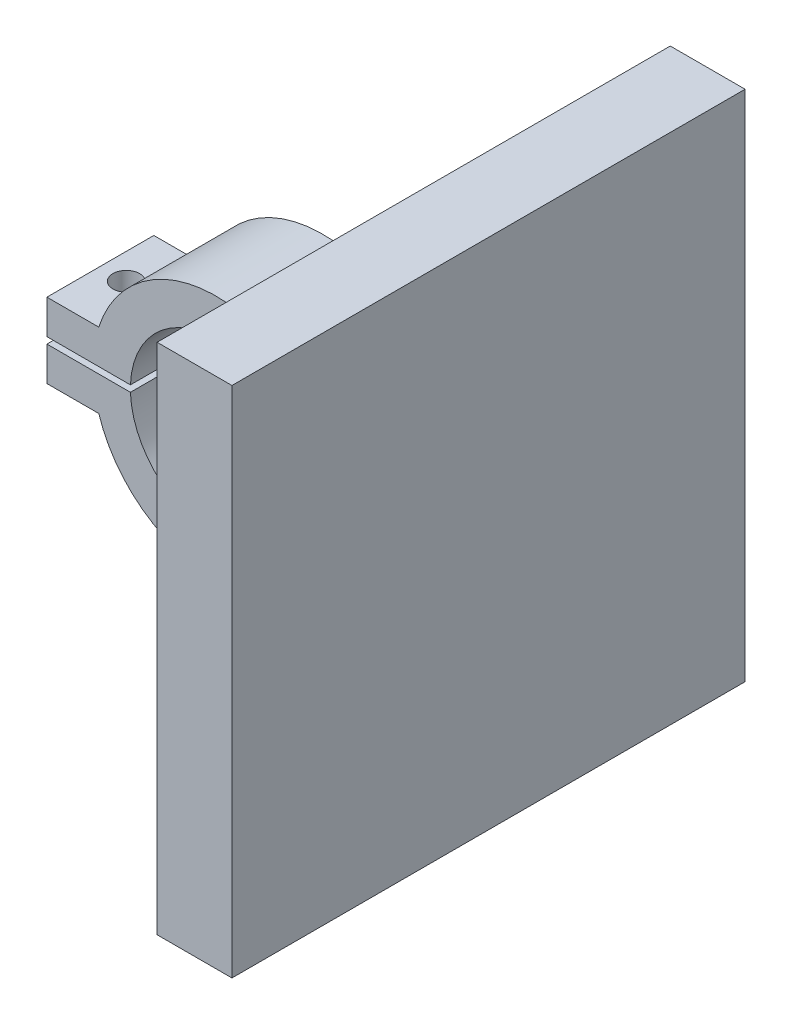
ISO-10303-21;
HEADER;
FILE_DESCRIPTION(('STEP AP214'),'2;1');
FILE_NAME('part.step','',(''),(''),'','','');
FILE_SCHEMA(('AUTOMOTIVE_DESIGN { 1 0 10303 214 1 1 1 1 }'));
ENDSEC;
DATA;
#1=APPLICATION_CONTEXT('core data for automotive mechanical design processes');
#2=APPLICATION_PROTOCOL_DEFINITION('international standard','automotive_design',2000,#1);
#3=PRODUCT_CONTEXT('',#1,'mechanical');
#4=PRODUCT('Part','Part','',(#3));
#5=PRODUCT_RELATED_PRODUCT_CATEGORY('part','',(#4));
#6=PRODUCT_DEFINITION_FORMATION('','',#4);
#7=PRODUCT_DEFINITION_CONTEXT('part definition',#1,'design');
#8=PRODUCT_DEFINITION('design','',#6,#7);
#9=PRODUCT_DEFINITION_SHAPE('','',#8);
#10=(LENGTH_UNIT() NAMED_UNIT(*) SI_UNIT(.MILLI.,.METRE.));
#11=(NAMED_UNIT(*) PLANE_ANGLE_UNIT() SI_UNIT($,.RADIAN.));
#12=(NAMED_UNIT(*) SI_UNIT($,.STERADIAN.) SOLID_ANGLE_UNIT());
#13=UNCERTAINTY_MEASURE_WITH_UNIT(LENGTH_MEASURE(1.E-05),#10,'distance_accuracy_value','');
#14=(GEOMETRIC_REPRESENTATION_CONTEXT(3) GLOBAL_UNCERTAINTY_ASSIGNED_CONTEXT((#13)) GLOBAL_UNIT_ASSIGNED_CONTEXT((#10,
#11,#12)) REPRESENTATION_CONTEXT('',''));
#15=CARTESIAN_POINT('',(0.,0.,0.));
#16=DIRECTION('',(0.,0.,1.));
#17=DIRECTION('',(1.,0.,0.));
#18=AXIS2_PLACEMENT_3D('',#15,#16,#17);
#19=CARTESIAN_POINT('',(0.,0.,5.));
#20=DIRECTION('',(0.,0.,-1.));
#21=DIRECTION('',(-1.,0.,0.));
#22=AXIS2_PLACEMENT_3D('',#19,#20,#21);
#23=CYLINDRICAL_SURFACE('',#22,5.75);
#24=CARTESIAN_POINT('',(0.,0.,0.));
#25=DIRECTION('',(0.,0.,1.));
#26=DIRECTION('',(1.,0.,0.));
#27=AXIS2_PLACEMENT_3D('',#24,#25,#26);
#28=CIRCLE('',#27,5.75);
#29=CARTESIAN_POINT('',(-5.47722557505166,-1.75,0.));
#30=VERTEX_POINT('',#29);
#31=CARTESIAN_POINT('',(5.39096466321196,-2.,0.));
#32=VERTEX_POINT('',#31);
#33=EDGE_CURVE('E164',#30,#32,#28,.T.);
#34=ORIENTED_EDGE('',*,*,#33,.T.);
#35=DIRECTION('',(0.,0.,-1.));
#36=VECTOR('',#35,1.);
#37=CARTESIAN_POINT('',(5.39096466321196,-2.,5.));
#38=LINE('',#37,#36);
#39=CARTESIAN_POINT('',(5.39096466321196,-2.,5.));
#40=VERTEX_POINT('',#39);
#41=EDGE_CURVE('E11',#40,#32,#38,.T.);
#42=ORIENTED_EDGE('',*,*,#41,.F.);
#43=CARTESIAN_POINT('',(0.,0.,5.));
#44=DIRECTION('',(0.,0.,1.));
#45=DIRECTION('',(1.,0.,0.));
#46=AXIS2_PLACEMENT_3D('',#43,#44,#45);
#47=CIRCLE('',#46,5.75);
#48=CARTESIAN_POINT('',(-5.47722557505166,-1.75,5.));
#49=VERTEX_POINT('',#48);
#50=EDGE_CURVE('E192',#49,#40,#47,.T.);
#51=ORIENTED_EDGE('',*,*,#50,.F.);
#52=DIRECTION('',(0.,0.,-1.));
#53=VECTOR('',#52,1.);
#54=CARTESIAN_POINT('',(-5.47722557505166,-1.75,5.));
#55=LINE('',#54,#53);
#56=EDGE_CURVE('E163',#49,#30,#55,.T.);
#57=ORIENTED_EDGE('',*,*,#56,.T.);
#58=EDGE_LOOP('',(#34,#42,#51,#57));
#59=FACE_BOUND('',#58,.T.);
#60=ADVANCED_FACE('F41',(#59),#23,.T.);
#61=CARTESIAN_POINT('',(0.,-2.,5.));
#62=DIRECTION('',(0.,1.,0.));
#63=DIRECTION('',(0.,0.,1.));
#64=AXIS2_PLACEMENT_3D('',#61,#62,#63);
#65=PLANE('',#64);
#66=DIRECTION('',(1.,0.,0.));
#67=VECTOR('',#66,1.);
#68=CARTESIAN_POINT('',(0.,-2.,0.));
#69=LINE('',#68,#67);
#70=CARTESIAN_POINT('',(6.7507426012175,-2.,0.));
#71=VERTEX_POINT('',#70);
#72=EDGE_CURVE('E167',#32,#71,#69,.T.);
#73=ORIENTED_EDGE('',*,*,#72,.T.);
#74=DIRECTION('',(0.,0.,-1.));
#75=VECTOR('',#74,1.);
#76=CARTESIAN_POINT('',(6.7507426012175,-2.,5.));
#77=LINE('',#76,#75);
#78=CARTESIAN_POINT('',(6.7507426012175,-2.,5.));
#79=VERTEX_POINT('',#78);
#80=EDGE_CURVE('E51',#79,#71,#77,.T.);
#81=ORIENTED_EDGE('',*,*,#80,.F.);
#82=DIRECTION('',(1.,0.,0.));
#83=VECTOR('',#82,1.);
#84=CARTESIAN_POINT('',(0.,-2.,5.));
#85=LINE('',#84,#83);
#86=EDGE_CURVE('E111',#40,#79,#85,.T.);
#87=ORIENTED_EDGE('',*,*,#86,.F.);
#88=ORIENTED_EDGE('',*,*,#41,.T.);
#89=EDGE_LOOP('',(#73,#81,#87,#88));
#90=FACE_BOUND('',#89,.T.);
#91=ADVANCED_FACE('F43',(#90),#65,.F.);
#92=CARTESIAN_POINT('',(0.,2.,5.));
#93=DIRECTION('',(0.,1.,0.));
#94=DIRECTION('',(0.,0.,1.));
#95=AXIS2_PLACEMENT_3D('',#92,#93,#94);
#96=PLANE('',#95);
#97=DIRECTION('',(1.,0.,0.));
#98=VECTOR('',#97,1.);
#99=CARTESIAN_POINT('',(0.,2.,0.));
#100=LINE('',#99,#98);
#101=CARTESIAN_POINT('',(5.39096466321196,2.,0.));
#102=VERTEX_POINT('',#101);
#103=CARTESIAN_POINT('',(6.7507426012175,2.,0.));
#104=VERTEX_POINT('',#103);
#105=EDGE_CURVE('E175',#102,#104,#100,.T.);
#106=ORIENTED_EDGE('',*,*,#105,.F.);
#107=DIRECTION('',(0.,0.,-1.));
#108=VECTOR('',#107,1.);
#109=CARTESIAN_POINT('',(5.39096466321196,2.,5.));
#110=LINE('',#109,#108);
#111=CARTESIAN_POINT('',(5.39096466321196,2.,5.));
#112=VERTEX_POINT('',#111);
#113=EDGE_CURVE('E205',#112,#102,#110,.T.);
#114=ORIENTED_EDGE('',*,*,#113,.F.);
#115=DIRECTION('',(1.,0.,0.));
#116=VECTOR('',#115,1.);
#117=CARTESIAN_POINT('',(0.,2.,5.));
#118=LINE('',#117,#116);
#119=CARTESIAN_POINT('',(6.7507426012175,2.,5.));
#120=VERTEX_POINT('',#119);
#121=EDGE_CURVE('E230',#112,#120,#118,.T.);
#122=ORIENTED_EDGE('',*,*,#121,.T.);
#123=DIRECTION('',(0.,0.,-1.));
#124=VECTOR('',#123,1.);
#125=CARTESIAN_POINT('',(6.7507426012175,2.,5.));
#126=LINE('',#125,#124);
#127=EDGE_CURVE('E207',#120,#104,#126,.T.);
#128=ORIENTED_EDGE('',*,*,#127,.T.);
#129=EDGE_LOOP('',(#106,#114,#122,#128));
#130=FACE_BOUND('',#129,.T.);
#131=ADVANCED_FACE('F226',(#130),#96,.T.);
#132=CARTESIAN_POINT('',(-5.47722557505166,1.75,0.));
#133=VERTEX_POINT('',#132);
#134=EDGE_CURVE('E169',#102,#133,#28,.T.);
#135=ORIENTED_EDGE('',*,*,#134,.T.);
#136=DIRECTION('',(0.,0.,-1.));
#137=VECTOR('',#136,1.);
#138=CARTESIAN_POINT('',(-5.47722557505166,1.75,5.));
#139=LINE('',#138,#137);
#140=CARTESIAN_POINT('',(-5.47722557505166,1.75,5.));
#141=VERTEX_POINT('',#140);
#142=EDGE_CURVE('E203',#141,#133,#139,.T.);
#143=ORIENTED_EDGE('',*,*,#142,.F.);
#144=EDGE_CURVE('E231',#112,#141,#47,.T.);
#145=ORIENTED_EDGE('',*,*,#144,.F.);
#146=ORIENTED_EDGE('',*,*,#113,.T.);
#147=EDGE_LOOP('',(#135,#143,#145,#146));
#148=FACE_BOUND('',#147,.T.);
#149=ADVANCED_FACE('F259',(#148),#23,.T.);
#150=CARTESIAN_POINT('',(0.,1.75,5.));
#151=DIRECTION('',(0.,1.,0.));
#152=DIRECTION('',(0.,0.,1.));
#153=AXIS2_PLACEMENT_3D('',#150,#151,#152);
#154=PLANE('',#153);
#155=CARTESIAN_POINT('',(-6.69017596628356,1.75,2.5));
#156=DIRECTION('',(0.,1.,0.));
#157=DIRECTION('',(0.,0.,1.));
#158=AXIS2_PLACEMENT_3D('',#155,#156,#157);
#159=CIRCLE('',#158,0.625);
#160=CARTESIAN_POINT('',(-6.69017596628356,1.75,3.125));
#161=VERTEX_POINT('',#160);
#162=EDGE_CURVE('E168',#161,#161,#159,.T.);
#163=ORIENTED_EDGE('',*,*,#162,.F.);
#164=EDGE_LOOP('',(#163));
#165=FACE_BOUND('',#164,.T.);
#166=DIRECTION('',(1.,0.,0.));
#167=VECTOR('',#166,1.);
#168=CARTESIAN_POINT('',(0.,1.75,0.));
#169=LINE('',#168,#167);
#170=CARTESIAN_POINT('',(-7.90312635751546,1.75,0.));
#171=VERTEX_POINT('',#170);
#172=EDGE_CURVE('E178',#171,#133,#169,.T.);
#173=ORIENTED_EDGE('',*,*,#172,.F.);
#174=DIRECTION('',(0.,0.,-1.));
#175=VECTOR('',#174,1.);
#176=CARTESIAN_POINT('',(-7.90312635751546,1.75,5.));
#177=LINE('',#176,#175);
#178=CARTESIAN_POINT('',(-7.90312635751546,1.75,5.));
#179=VERTEX_POINT('',#178);
#180=EDGE_CURVE('E201',#179,#171,#177,.T.);
#181=ORIENTED_EDGE('',*,*,#180,.F.);
#182=DIRECTION('',(1.,0.,0.));
#183=VECTOR('',#182,1.);
#184=CARTESIAN_POINT('',(0.,1.75,5.));
#185=LINE('',#184,#183);
#186=EDGE_CURVE('E233',#179,#141,#185,.T.);
#187=ORIENTED_EDGE('',*,*,#186,.T.);
#188=ORIENTED_EDGE('',*,*,#142,.T.);
#189=EDGE_LOOP('',(#173,#181,#187,#188));
#190=FACE_BOUND('',#189,.T.);
#191=ADVANCED_FACE('F256',(#165,#190),#154,.T.);
#192=CARTESIAN_POINT('',(-7.90312635751546,0.,5.));
#193=DIRECTION('',(1.,0.,0.));
#194=DIRECTION('',(0.,0.,-1.));
#195=AXIS2_PLACEMENT_3D('',#192,#193,#194);
#196=PLANE('',#195);
#197=DIRECTION('',(0.,-1.,0.));
#198=VECTOR('',#197,1.);
#199=CARTESIAN_POINT('',(-7.90312635751546,0.,0.));
#200=LINE('',#199,#198);
#201=CARTESIAN_POINT('',(-7.90312635751546,0.149999999999998,0.));
#202=VERTEX_POINT('',#201);
#203=EDGE_CURVE('E181',#171,#202,#200,.T.);
#204=ORIENTED_EDGE('',*,*,#203,.T.);
#205=DIRECTION('',(0.,0.,-1.));
#206=VECTOR('',#205,1.);
#207=CARTESIAN_POINT('',(-7.90312635751546,0.149999999999998,5.));
#208=LINE('',#207,#206);
#209=CARTESIAN_POINT('',(-7.90312635751546,0.149999999999998,5.));
#210=VERTEX_POINT('',#209);
#211=EDGE_CURVE('E198',#210,#202,#208,.T.);
#212=ORIENTED_EDGE('',*,*,#211,.F.);
#213=DIRECTION('',(0.,-1.,0.));
#214=VECTOR('',#213,1.);
#215=CARTESIAN_POINT('',(-7.90312635751546,0.,5.));
#216=LINE('',#215,#214);
#217=EDGE_CURVE('E240',#179,#210,#216,.T.);
#218=ORIENTED_EDGE('',*,*,#217,.F.);
#219=ORIENTED_EDGE('',*,*,#180,.T.);
#220=EDGE_LOOP('',(#204,#212,#218,#219));
#221=FACE_BOUND('',#220,.T.);
#222=ADVANCED_FACE('F266',(#221),#196,.F.);
#223=CARTESIAN_POINT('',(0.,0.149999999999999,5.));
#224=DIRECTION('',(0.,1.,0.));
#225=DIRECTION('',(-1.,0.,0.));
#226=AXIS2_PLACEMENT_3D('',#223,#224,#225);
#227=PLANE('',#226);
#228=CARTESIAN_POINT('',(-6.69017596628356,0.149999999999998,2.5));
#229=DIRECTION('',(0.,1.,0.));
#230=DIRECTION('',(-1.,0.,0.));
#231=AXIS2_PLACEMENT_3D('',#228,#229,#230);
#232=CIRCLE('',#231,0.625);
#233=CARTESIAN_POINT('',(-7.31517596628356,0.149999999999998,2.5));
#234=VERTEX_POINT('',#233);
#235=EDGE_CURVE('E556',#234,#234,#232,.T.);
#236=ORIENTED_EDGE('',*,*,#235,.T.);
#237=EDGE_LOOP('',(#236));
#238=FACE_BOUND('',#237,.T.);
#239=DIRECTION('',(1.,0.,0.));
#240=VECTOR('',#239,1.);
#241=CARTESIAN_POINT('',(0.,0.149999999999999,0.));
#242=LINE('',#241,#240);
#243=CARTESIAN_POINT('',(-3.99718651053463,0.149999999999999,0.));
#244=VERTEX_POINT('',#243);
#245=EDGE_CURVE('E183',#202,#244,#242,.T.);
#246=ORIENTED_EDGE('',*,*,#245,.T.);
#247=DIRECTION('',(0.,0.,-1.));
#248=VECTOR('',#247,1.);
#249=CARTESIAN_POINT('',(-3.99718651053463,0.149999999999999,5.));
#250=LINE('',#249,#248);
#251=CARTESIAN_POINT('',(-3.99718651053463,0.149999999999999,5.));
#252=VERTEX_POINT('',#251);
#253=EDGE_CURVE('E196',#252,#244,#250,.T.);
#254=ORIENTED_EDGE('',*,*,#253,.F.);
#255=DIRECTION('',(1.,0.,0.));
#256=VECTOR('',#255,1.);
#257=CARTESIAN_POINT('',(0.,0.149999999999999,5.));
#258=LINE('',#257,#256);
#259=EDGE_CURVE('E158',#210,#252,#258,.T.);
#260=ORIENTED_EDGE('',*,*,#259,.F.);
#261=ORIENTED_EDGE('',*,*,#211,.T.);
#262=EDGE_LOOP('',(#246,#254,#260,#261));
#263=FACE_BOUND('',#262,.T.);
#264=ADVANCED_FACE('F247',(#238,#263),#227,.F.);
#265=CARTESIAN_POINT('',(0.,0.,5.));
#266=DIRECTION('',(0.,0.,-1.));
#267=DIRECTION('',(-1.,0.,0.));
#268=AXIS2_PLACEMENT_3D('',#265,#266,#267);
#269=CYLINDRICAL_SURFACE('',#268,4.);
#270=CARTESIAN_POINT('',(0.,0.,0.));
#271=DIRECTION('',(0.,0.,1.));
#272=DIRECTION('',(1.,0.,0.));
#273=AXIS2_PLACEMENT_3D('',#270,#271,#272);
#274=CIRCLE('',#273,4.);
#275=CARTESIAN_POINT('',(-3.99718651053463,-0.150000000000001,0.));
#276=VERTEX_POINT('',#275);
#277=EDGE_CURVE('E186',#276,#244,#274,.T.);
#278=ORIENTED_EDGE('',*,*,#277,.F.);
#279=DIRECTION('',(0.,0.,-1.));
#280=VECTOR('',#279,1.);
#281=CARTESIAN_POINT('',(-3.99718651053463,-0.150000000000001,5.));
#282=LINE('',#281,#280);
#283=CARTESIAN_POINT('',(-3.99718651053463,-0.150000000000001,5.));
#284=VERTEX_POINT('',#283);
#285=EDGE_CURVE('E147',#284,#276,#282,.T.);
#286=ORIENTED_EDGE('',*,*,#285,.F.);
#287=CARTESIAN_POINT('',(0.,0.,5.));
#288=DIRECTION('',(0.,0.,1.));
#289=DIRECTION('',(1.,0.,0.));
#290=AXIS2_PLACEMENT_3D('',#287,#288,#289);
#291=CIRCLE('',#290,4.);
#292=EDGE_CURVE('E156',#284,#252,#291,.T.);
#293=ORIENTED_EDGE('',*,*,#292,.T.);
#294=ORIENTED_EDGE('',*,*,#253,.T.);
#295=EDGE_LOOP('',(#278,#286,#293,#294));
#296=FACE_BOUND('',#295,.T.);
#297=ADVANCED_FACE('F251',(#296),#269,.F.);
#298=CARTESIAN_POINT('',(0.,-0.150000000000001,5.));
#299=DIRECTION('',(0.,1.,0.));
#300=DIRECTION('',(-1.,0.,0.));
#301=AXIS2_PLACEMENT_3D('',#298,#299,#300);
#302=PLANE('',#301);
#303=CARTESIAN_POINT('',(-6.69017596628356,-0.150000000000002,2.5));
#304=DIRECTION('',(0.,1.,0.));
#305=DIRECTION('',(-1.,0.,0.));
#306=AXIS2_PLACEMENT_3D('',#303,#304,#305);
#307=CIRCLE('',#306,0.625);
#308=CARTESIAN_POINT('',(-7.31517596628356,-0.150000000000002,2.5));
#309=VERTEX_POINT('',#308);
#310=EDGE_CURVE('E548',#309,#309,#307,.T.);
#311=ORIENTED_EDGE('',*,*,#310,.F.);
#312=EDGE_LOOP('',(#311));
#313=FACE_BOUND('',#312,.T.);
#314=DIRECTION('',(1.,0.,0.));
#315=VECTOR('',#314,1.);
#316=CARTESIAN_POINT('',(0.,-0.150000000000001,0.));
#317=LINE('',#316,#315);
#318=CARTESIAN_POINT('',(-7.90312635751546,-0.150000000000002,0.));
#319=VERTEX_POINT('',#318);
#320=EDGE_CURVE('E146',#319,#276,#317,.T.);
#321=ORIENTED_EDGE('',*,*,#320,.F.);
#322=DIRECTION('',(0.,0.,-1.));
#323=VECTOR('',#322,1.);
#324=CARTESIAN_POINT('',(-7.90312635751546,-0.150000000000002,5.));
#325=LINE('',#324,#323);
#326=CARTESIAN_POINT('',(-7.90312635751546,-0.150000000000002,5.));
#327=VERTEX_POINT('',#326);
#328=EDGE_CURVE('E140',#327,#319,#325,.T.);
#329=ORIENTED_EDGE('',*,*,#328,.F.);
#330=DIRECTION('',(1.,0.,0.));
#331=VECTOR('',#330,1.);
#332=CARTESIAN_POINT('',(0.,-0.150000000000001,5.));
#333=LINE('',#332,#331);
#334=EDGE_CURVE('E144',#327,#284,#333,.T.);
#335=ORIENTED_EDGE('',*,*,#334,.T.);
#336=ORIENTED_EDGE('',*,*,#285,.T.);
#337=EDGE_LOOP('',(#321,#329,#335,#336));
#338=FACE_BOUND('',#337,.T.);
#339=ADVANCED_FACE('F142',(#313,#338),#302,.T.);
#340=CARTESIAN_POINT('',(-7.90312635751546,0.,5.));
#341=DIRECTION('',(1.,0.,0.));
#342=DIRECTION('',(0.,0.,-1.));
#343=AXIS2_PLACEMENT_3D('',#340,#341,#342);
#344=PLANE('',#343);
#345=DIRECTION('',(0.,-1.,0.));
#346=VECTOR('',#345,1.);
#347=CARTESIAN_POINT('',(-7.90312635751546,0.,0.));
#348=LINE('',#347,#346);
#349=CARTESIAN_POINT('',(-7.90312635751546,-1.75,0.));
#350=VERTEX_POINT('',#349);
#351=EDGE_CURVE('E97',#319,#350,#348,.T.);
#352=ORIENTED_EDGE('',*,*,#351,.T.);
#353=DIRECTION('',(0.,0.,-1.));
#354=VECTOR('',#353,1.);
#355=CARTESIAN_POINT('',(-7.90312635751546,-1.75,5.));
#356=LINE('',#355,#354);
#357=CARTESIAN_POINT('',(-7.90312635751546,-1.75,5.));
#358=VERTEX_POINT('',#357);
#359=EDGE_CURVE('E148',#358,#350,#356,.T.);
#360=ORIENTED_EDGE('',*,*,#359,.F.);
#361=DIRECTION('',(0.,-1.,0.));
#362=VECTOR('',#361,1.);
#363=CARTESIAN_POINT('',(-7.90312635751546,0.,5.));
#364=LINE('',#363,#362);
#365=EDGE_CURVE('E150',#327,#358,#364,.T.);
#366=ORIENTED_EDGE('',*,*,#365,.F.);
#367=ORIENTED_EDGE('',*,*,#328,.T.);
#368=EDGE_LOOP('',(#352,#360,#366,#367));
#369=FACE_BOUND('',#368,.T.);
#370=ADVANCED_FACE('F151',(#369),#344,.F.);
#371=CARTESIAN_POINT('',(0.,-1.75,5.));
#372=DIRECTION('',(0.,1.,0.));
#373=DIRECTION('',(0.,0.,1.));
#374=AXIS2_PLACEMENT_3D('',#371,#372,#373);
#375=PLANE('',#374);
#376=CARTESIAN_POINT('',(-6.69017596628356,-1.75,2.5));
#377=DIRECTION('',(0.,1.,0.));
#378=DIRECTION('',(0.,0.,1.));
#379=AXIS2_PLACEMENT_3D('',#376,#377,#378);
#380=CIRCLE('',#379,0.625);
#381=CARTESIAN_POINT('',(-6.69017596628356,-1.75,3.125));
#382=VERTEX_POINT('',#381);
#383=EDGE_CURVE('E45',#382,#382,#380,.T.);
#384=ORIENTED_EDGE('',*,*,#383,.T.);
#385=EDGE_LOOP('',(#384));
#386=FACE_BOUND('',#385,.T.);
#387=DIRECTION('',(1.,0.,0.));
#388=VECTOR('',#387,1.);
#389=CARTESIAN_POINT('',(0.,-1.75,0.));
#390=LINE('',#389,#388);
#391=EDGE_CURVE('E103',#350,#30,#390,.T.);
#392=ORIENTED_EDGE('',*,*,#391,.T.);
#393=ORIENTED_EDGE('',*,*,#56,.F.);
#394=DIRECTION('',(1.,0.,0.));
#395=VECTOR('',#394,1.);
#396=CARTESIAN_POINT('',(0.,-1.75,5.));
#397=LINE('',#396,#395);
#398=EDGE_CURVE('E59',#358,#49,#397,.T.);
#399=ORIENTED_EDGE('',*,*,#398,.F.);
#400=ORIENTED_EDGE('',*,*,#359,.T.);
#401=EDGE_LOOP('',(#392,#393,#399,#400));
#402=FACE_BOUND('',#401,.T.);
#403=ADVANCED_FACE('F275',(#386,#402),#375,.F.);
#404=CARTESIAN_POINT('',(0.,0.,5.));
#405=DIRECTION('',(0.,0.,1.));
#406=DIRECTION('',(1.,0.,0.));
#407=AXIS2_PLACEMENT_3D('',#404,#405,#406);
#408=PLANE('',#407);
#409=ORIENTED_EDGE('',*,*,#50,.T.);
#410=ORIENTED_EDGE('',*,*,#86,.T.);
#411=DIRECTION('',(0.,-1.,0.));
#412=VECTOR('',#411,1.);
#413=CARTESIAN_POINT('',(6.7507426012175,0.,5.));
#414=LINE('',#413,#412);
#415=EDGE_CURVE('E216',#120,#79,#414,.T.);
#416=ORIENTED_EDGE('',*,*,#415,.F.);
#417=ORIENTED_EDGE('',*,*,#121,.F.);
#418=ORIENTED_EDGE('',*,*,#144,.T.);
#419=ORIENTED_EDGE('',*,*,#186,.F.);
#420=ORIENTED_EDGE('',*,*,#217,.T.);
#421=ORIENTED_EDGE('',*,*,#259,.T.);
#422=ORIENTED_EDGE('',*,*,#292,.F.);
#423=ORIENTED_EDGE('',*,*,#334,.F.);
#424=ORIENTED_EDGE('',*,*,#365,.T.);
#425=ORIENTED_EDGE('',*,*,#398,.T.);
#426=EDGE_LOOP('',(#409,#410,#416,#417,#418,#419,#420,#421,#422,#423,#424,#425));
#427=FACE_BOUND('',#426,.T.);
#428=ADVANCED_FACE('F154',(#427),#408,.T.);
#429=CARTESIAN_POINT('',(0.,0.,0.));
#430=DIRECTION('',(0.,0.,1.));
#431=DIRECTION('',(1.,0.,0.));
#432=AXIS2_PLACEMENT_3D('',#429,#430,#431);
#433=PLANE('',#432);
#434=ORIENTED_EDGE('',*,*,#33,.F.);
#435=ORIENTED_EDGE('',*,*,#391,.F.);
#436=ORIENTED_EDGE('',*,*,#351,.F.);
#437=ORIENTED_EDGE('',*,*,#320,.T.);
#438=ORIENTED_EDGE('',*,*,#277,.T.);
#439=ORIENTED_EDGE('',*,*,#245,.F.);
#440=ORIENTED_EDGE('',*,*,#203,.F.);
#441=ORIENTED_EDGE('',*,*,#172,.T.);
#442=ORIENTED_EDGE('',*,*,#134,.F.);
#443=ORIENTED_EDGE('',*,*,#105,.T.);
#444=DIRECTION('',(0.,-1.,0.));
#445=VECTOR('',#444,1.);
#446=CARTESIAN_POINT('',(6.7507426012175,0.,0.));
#447=LINE('',#446,#445);
#448=EDGE_CURVE('E172',#104,#71,#447,.T.);
#449=ORIENTED_EDGE('',*,*,#448,.T.);
#450=ORIENTED_EDGE('',*,*,#72,.F.);
#451=EDGE_LOOP('',(#434,#435,#436,#437,#438,#439,#440,#441,#442,#443,#449,#450));
#452=FACE_BOUND('',#451,.T.);
#453=ADVANCED_FACE('F221',(#452),#433,.F.);
#454=CARTESIAN_POINT('',(-6.69017596628356,-5.75,2.5));
#455=DIRECTION('',(0.,1.,0.));
#456=DIRECTION('',(0.,0.,1.));
#457=AXIS2_PLACEMENT_3D('',#454,#455,#456);
#458=CYLINDRICAL_SURFACE('',#457,0.625);
#459=ORIENTED_EDGE('',*,*,#310,.T.);
#460=EDGE_LOOP('',(#459));
#461=FACE_BOUND('',#460,.T.);
#462=ORIENTED_EDGE('',*,*,#383,.F.);
#463=EDGE_LOOP('',(#462));
#464=FACE_BOUND('',#463,.T.);
#465=ADVANCED_FACE('F366',(#461,#464),#458,.F.);
#466=ORIENTED_EDGE('',*,*,#162,.T.);
#467=EDGE_LOOP('',(#466));
#468=FACE_BOUND('',#467,.T.);
#469=ORIENTED_EDGE('',*,*,#235,.F.);
#470=EDGE_LOOP('',(#469));
#471=FACE_BOUND('',#470,.T.);
#472=ADVANCED_FACE('F375',(#468,#471),#458,.F.);
#473=CARTESIAN_POINT('',(10.2507426012175,12.,-9.49999999999999));
#474=DIRECTION('',(0.,0.,1.));
#475=DIRECTION('',(0.,-1.,0.));
#476=AXIS2_PLACEMENT_3D('',#473,#474,#475);
#477=PLANE('',#476);
#478=DIRECTION('',(0.,1.,0.));
#479=VECTOR('',#478,1.);
#480=CARTESIAN_POINT('',(6.7507426012175,12.,-9.49999999999999));
#481=LINE('',#480,#479);
#482=CARTESIAN_POINT('',(6.7507426012175,-12.,-9.5));
#483=VERTEX_POINT('',#482);
#484=CARTESIAN_POINT('',(6.7507426012175,12.,-9.49999999999999));
#485=VERTEX_POINT('',#484);
#486=EDGE_CURVE('E544',#483,#485,#481,.T.);
#487=ORIENTED_EDGE('',*,*,#486,.T.);
#488=DIRECTION('',(-1.,0.,0.));
#489=VECTOR('',#488,1.);
#490=CARTESIAN_POINT('',(10.2507426012175,12.,-9.49999999999999));
#491=LINE('',#490,#489);
#492=CARTESIAN_POINT('',(10.2507426012175,12.,-9.49999999999999));
#493=VERTEX_POINT('',#492);
#494=EDGE_CURVE('E541',#493,#485,#491,.T.);
#495=ORIENTED_EDGE('',*,*,#494,.F.);
#496=DIRECTION('',(0.,1.,0.));
#497=VECTOR('',#496,1.);
#498=CARTESIAN_POINT('',(10.2507426012175,12.,-9.49999999999999));
#499=LINE('',#498,#497);
#500=CARTESIAN_POINT('',(10.2507426012175,-12.,-9.5));
#501=VERTEX_POINT('',#500);
#502=EDGE_CURVE('E524',#501,#493,#499,.T.);
#503=ORIENTED_EDGE('',*,*,#502,.F.);
#504=DIRECTION('',(-1.,0.,0.));
#505=VECTOR('',#504,1.);
#506=CARTESIAN_POINT('',(10.2507426012175,-12.,-9.5));
#507=LINE('',#506,#505);
#508=EDGE_CURVE('E568',#501,#483,#507,.T.);
#509=ORIENTED_EDGE('',*,*,#508,.T.);
#510=EDGE_LOOP('',(#487,#495,#503,#509));
#511=FACE_BOUND('',#510,.T.);
#512=ADVANCED_FACE('F386',(#511),#477,.F.);
#513=CARTESIAN_POINT('',(10.2507426012175,12.,14.5));
#514=DIRECTION('',(0.,-1.,0.));
#515=DIRECTION('',(0.,0.,-1.));
#516=AXIS2_PLACEMENT_3D('',#513,#514,#515);
#517=PLANE('',#516);
#518=DIRECTION('',(0.,0.,1.));
#519=VECTOR('',#518,1.);
#520=CARTESIAN_POINT('',(6.7507426012175,12.,14.5));
#521=LINE('',#520,#519);
#522=CARTESIAN_POINT('',(6.7507426012175,12.,14.5));
#523=VERTEX_POINT('',#522);
#524=EDGE_CURVE('E575',#485,#523,#521,.T.);
#525=ORIENTED_EDGE('',*,*,#524,.T.);
#526=DIRECTION('',(-1.,0.,0.));
#527=VECTOR('',#526,1.);
#528=CARTESIAN_POINT('',(10.2507426012175,12.,14.5));
#529=LINE('',#528,#527);
#530=CARTESIAN_POINT('',(10.2507426012175,12.,14.5));
#531=VERTEX_POINT('',#530);
#532=EDGE_CURVE('E546',#531,#523,#529,.T.);
#533=ORIENTED_EDGE('',*,*,#532,.F.);
#534=DIRECTION('',(0.,0.,1.));
#535=VECTOR('',#534,1.);
#536=CARTESIAN_POINT('',(10.2507426012175,12.,14.5));
#537=LINE('',#536,#535);
#538=EDGE_CURVE('E529',#493,#531,#537,.T.);
#539=ORIENTED_EDGE('',*,*,#538,.F.);
#540=ORIENTED_EDGE('',*,*,#494,.T.);
#541=EDGE_LOOP('',(#525,#533,#539,#540));
#542=FACE_BOUND('',#541,.T.);
#543=ADVANCED_FACE('F395',(#542),#517,.F.);
#544=CARTESIAN_POINT('',(10.2507426012175,12.,14.5));
#545=DIRECTION('',(0.,0.,-1.));
#546=DIRECTION('',(0.,1.,0.));
#547=AXIS2_PLACEMENT_3D('',#544,#545,#546);
#548=PLANE('',#547);
#549=DIRECTION('',(0.,-1.,0.));
#550=VECTOR('',#549,1.);
#551=CARTESIAN_POINT('',(6.7507426012175,12.,14.5));
#552=LINE('',#551,#550);
#553=CARTESIAN_POINT('',(6.7507426012175,-12.,14.5));
#554=VERTEX_POINT('',#553);
#555=EDGE_CURVE('E572',#523,#554,#552,.T.);
#556=ORIENTED_EDGE('',*,*,#555,.T.);
#557=DIRECTION('',(-1.,0.,0.));
#558=VECTOR('',#557,1.);
#559=CARTESIAN_POINT('',(10.2507426012175,-12.,14.5));
#560=LINE('',#559,#558);
#561=CARTESIAN_POINT('',(10.2507426012175,-12.,14.5));
#562=VERTEX_POINT('',#561);
#563=EDGE_CURVE('E550',#562,#554,#560,.T.);
#564=ORIENTED_EDGE('',*,*,#563,.F.);
#565=DIRECTION('',(0.,-1.,0.));
#566=VECTOR('',#565,1.);
#567=CARTESIAN_POINT('',(10.2507426012175,12.,14.5));
#568=LINE('',#567,#566);
#569=EDGE_CURVE('E579',#531,#562,#568,.T.);
#570=ORIENTED_EDGE('',*,*,#569,.F.);
#571=ORIENTED_EDGE('',*,*,#532,.T.);
#572=EDGE_LOOP('',(#556,#564,#570,#571));
#573=FACE_BOUND('',#572,.T.);
#574=ADVANCED_FACE('F405',(#573),#548,.F.);
#575=CARTESIAN_POINT('',(10.2507426012175,-12.,14.5));
#576=DIRECTION('',(0.,1.,0.));
#577=DIRECTION('',(0.,0.,1.));
#578=AXIS2_PLACEMENT_3D('',#575,#576,#577);
#579=PLANE('',#578);
#580=DIRECTION('',(0.,0.,-1.));
#581=VECTOR('',#580,1.);
#582=CARTESIAN_POINT('',(6.7507426012175,-12.,14.5));
#583=LINE('',#582,#581);
#584=EDGE_CURVE('E537',#554,#483,#583,.T.);
#585=ORIENTED_EDGE('',*,*,#584,.T.);
#586=ORIENTED_EDGE('',*,*,#508,.F.);
#587=DIRECTION('',(0.,0.,-1.));
#588=VECTOR('',#587,1.);
#589=CARTESIAN_POINT('',(10.2507426012175,-12.,14.5));
#590=LINE('',#589,#588);
#591=EDGE_CURVE('E532',#562,#501,#590,.T.);
#592=ORIENTED_EDGE('',*,*,#591,.F.);
#593=ORIENTED_EDGE('',*,*,#563,.T.);
#594=EDGE_LOOP('',(#585,#586,#592,#593));
#595=FACE_BOUND('',#594,.T.);
#596=ADVANCED_FACE('F415',(#595),#579,.F.);
#597=CARTESIAN_POINT('',(10.2507426012175,0.,0.));
#598=DIRECTION('',(1.,0.,0.));
#599=DIRECTION('',(0.,0.,-1.));
#600=AXIS2_PLACEMENT_3D('',#597,#598,#599);
#601=PLANE('',#600);
#602=ORIENTED_EDGE('',*,*,#502,.T.);
#603=ORIENTED_EDGE('',*,*,#538,.T.);
#604=ORIENTED_EDGE('',*,*,#569,.T.);
#605=ORIENTED_EDGE('',*,*,#591,.T.);
#606=EDGE_LOOP('',(#602,#603,#604,#605));
#607=FACE_BOUND('',#606,.T.);
#608=ADVANCED_FACE('F425',(#607),#601,.T.);
#609=CARTESIAN_POINT('',(6.7507426012175,0.,0.));
#610=DIRECTION('',(1.,0.,0.));
#611=DIRECTION('',(0.,0.,-1.));
#612=AXIS2_PLACEMENT_3D('',#609,#610,#611);
#613=PLANE('',#612);
#614=ORIENTED_EDGE('',*,*,#448,.F.);
#615=ORIENTED_EDGE('',*,*,#127,.F.);
#616=ORIENTED_EDGE('',*,*,#415,.T.);
#617=ORIENTED_EDGE('',*,*,#80,.T.);
#618=EDGE_LOOP('',(#614,#615,#616,#617));
#619=FACE_BOUND('',#618,.T.);
#620=ORIENTED_EDGE('',*,*,#486,.F.);
#621=ORIENTED_EDGE('',*,*,#584,.F.);
#622=ORIENTED_EDGE('',*,*,#555,.F.);
#623=ORIENTED_EDGE('',*,*,#524,.F.);
#624=EDGE_LOOP('',(#620,#621,#622,#623));
#625=FACE_BOUND('',#624,.T.);
#626=ADVANCED_FACE('F213',(#619,#625),#613,.F.);
#627=CLOSED_SHELL('',(#60,#91,#131,#149,#191,#222,#264,#297,#339,#370,#403,#428,#453,#465,#472,
#512,#543,#574,#596,#608,#626));
#628=MANIFOLD_SOLID_BREP('B2',#627);
#629=ADVANCED_BREP_SHAPE_REPRESENTATION('',(#18,#628),#14);
#630=SHAPE_DEFINITION_REPRESENTATION(#9,#629);
ENDSEC;
END-ISO-10303-21;
